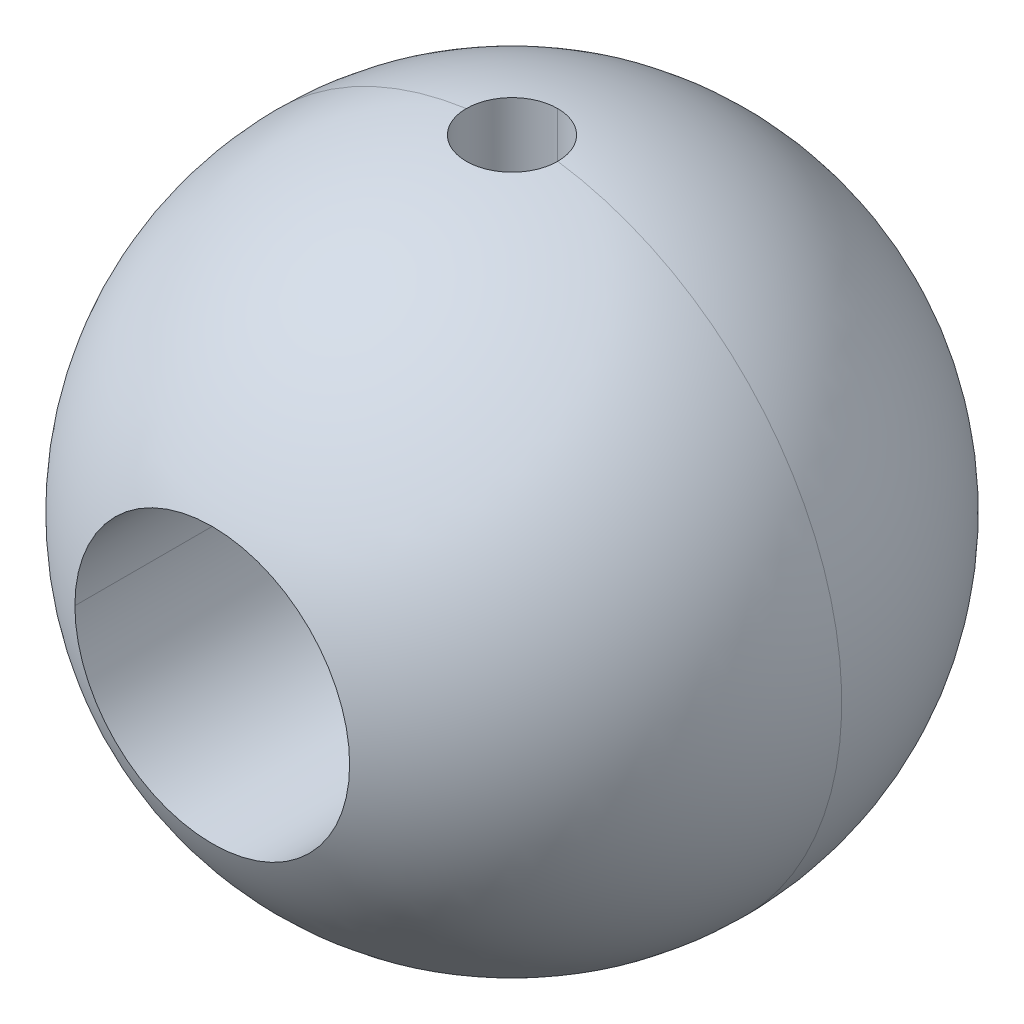
ISO-10303-21;
HEADER;
FILE_DESCRIPTION(('STEP AP214'),'2;1');
FILE_NAME('part.step','',(''),(''),'','','');
FILE_SCHEMA(('AUTOMOTIVE_DESIGN { 1 0 10303 214 1 1 1 1 }'));
ENDSEC;
DATA;
#1=APPLICATION_CONTEXT('core data for automotive mechanical design processes');
#2=APPLICATION_PROTOCOL_DEFINITION('international standard','automotive_design',2000,#1);
#3=PRODUCT_CONTEXT('',#1,'mechanical');
#4=PRODUCT('Part','Part','',(#3));
#5=PRODUCT_RELATED_PRODUCT_CATEGORY('part','',(#4));
#6=PRODUCT_DEFINITION_FORMATION('','',#4);
#7=PRODUCT_DEFINITION_CONTEXT('part definition',#1,'design');
#8=PRODUCT_DEFINITION('design','',#6,#7);
#9=PRODUCT_DEFINITION_SHAPE('','',#8);
#10=(LENGTH_UNIT() NAMED_UNIT(*) SI_UNIT(.MILLI.,.METRE.));
#11=(NAMED_UNIT(*) PLANE_ANGLE_UNIT() SI_UNIT($,.RADIAN.));
#12=(NAMED_UNIT(*) SI_UNIT($,.STERADIAN.) SOLID_ANGLE_UNIT());
#13=UNCERTAINTY_MEASURE_WITH_UNIT(LENGTH_MEASURE(1.E-05),#10,'distance_accuracy_value','');
#14=(GEOMETRIC_REPRESENTATION_CONTEXT(3) GLOBAL_UNCERTAINTY_ASSIGNED_CONTEXT((#13)) GLOBAL_UNIT_ASSIGNED_CONTEXT((#10,
#11,#12)) REPRESENTATION_CONTEXT('',''));
#15=CARTESIAN_POINT('',(0.,0.,0.));
#16=DIRECTION('',(0.,0.,1.));
#17=DIRECTION('',(1.,0.,0.));
#18=AXIS2_PLACEMENT_3D('',#15,#16,#17);
#19=CARTESIAN_POINT('',(0.,0.,-8.6587902516));
#20=DIRECTION('',(0.,0.,1.));
#21=DIRECTION('',(1.,0.,0.));
#22=AXIS2_PLACEMENT_3D('',#19,#20,#21);
#23=CYLINDRICAL_SURFACE('',#22,3.96875);
#24=DIRECTION('',(0.,0.,1.));
#25=VECTOR('',#24,1.);
#26=CARTESIAN_POINT('',(3.96875,-7.12736925620965E-10,0.));
#27=LINE('',#26,#25);
#28=CARTESIAN_POINT('',(3.96875,-3.56368462810483E-10,8.6587902516));
#29=VERTEX_POINT('',#28);
#30=CARTESIAN_POINT('',(3.96875,-7.12736925620965E-10,-8.6587902516));
#31=VERTEX_POINT('',#30);
#32=EDGE_CURVE('E165',#29,#31,#27,.F.);
#33=ORIENTED_EDGE('',*,*,#32,.F.);
#34=CARTESIAN_POINT('',(0.,0.,8.6587902516));
#35=DIRECTION('',(0.,0.,1.));
#36=DIRECTION('',(1.,0.,0.));
#37=AXIS2_PLACEMENT_3D('',#34,#35,#36);
#38=CIRCLE('',#37,3.96875);
#39=CARTESIAN_POINT('',(-3.96875,-1.62800758261697E-09,8.6587902516));
#40=VERTEX_POINT('',#39);
#41=EDGE_CURVE('E157',#29,#40,#38,.T.);
#42=ORIENTED_EDGE('',*,*,#41,.T.);
#43=DIRECTION('',(0.,0.,-1.));
#44=VECTOR('',#43,1.);
#45=CARTESIAN_POINT('',(-3.96875,-1.62800846385649E-09,0.));
#46=LINE('',#45,#44);
#47=CARTESIAN_POINT('',(-3.96875,-1.62800797784085E-09,-8.6587902516));
#48=VERTEX_POINT('',#47);
#49=EDGE_CURVE('E161',#48,#40,#46,.F.);
#50=ORIENTED_EDGE('',*,*,#49,.F.);
#51=CARTESIAN_POINT('',(0.,0.,-8.6587902516));
#52=DIRECTION('',(0.,0.,1.));
#53=DIRECTION('',(1.,0.,0.));
#54=AXIS2_PLACEMENT_3D('',#51,#52,#53);
#55=CIRCLE('',#54,3.96875);
#56=EDGE_CURVE('E99',#31,#48,#55,.T.);
#57=ORIENTED_EDGE('',*,*,#56,.F.);
#58=EDGE_LOOP('',(#33,#42,#50,#57));
#59=FACE_BOUND('',#58,.T.);
#60=CARTESIAN_POINT('',(-5.41800906794258E-10,3.96875,-1.3208));
#61=CARTESIAN_POINT('',(0.0361049955437085,3.9687526643952,-1.32080083444211));
#62=CARTESIAN_POINT('',(0.0721917891521218,3.96825672626489,-1.31931860426641));
#63=CARTESIAN_POINT('',(0.144089183652949,3.9662961150903,-1.31341250629876));
#64=CARTESIAN_POINT('',(0.179899845887164,3.96483166386044,-1.30898931206203));
#65=CARTESIAN_POINT('',(0.286327873673207,3.9590417541917,-1.29138617214641));
#66=CARTESIAN_POINT('',(0.356203534754286,3.95331932807667,-1.273872253859));
#67=CARTESIAN_POINT('',(0.491825460845371,3.93874966947145,-1.22790658851783));
#68=CARTESIAN_POINT('',(0.557573256463703,3.92990360338031,-1.19945892388634));
#69=CARTESIAN_POINT('',(0.683394658019107,3.90998829049197,-1.13250359659386));
#70=CARTESIAN_POINT('',(0.743465411632875,3.89891793478214,-1.09399091315782));
#71=CARTESIAN_POINT('',(0.858255942415323,3.8752957505329,-1.0066147546163));
#72=CARTESIAN_POINT('',(0.9127525544827,3.86270867381294,-0.957467804720228));
#73=CARTESIAN_POINT('',(1.01290456078959,3.83766475411566,-0.850817359497009));
#74=CARTESIAN_POINT('',(1.05855763148802,3.82520794617606,-0.793311674934132));
#75=CARTESIAN_POINT('',(1.14100147428762,3.80144582595455,-0.669560357406593));
#76=CARTESIAN_POINT('',(1.17750092851826,3.79018371909285,-0.603111555368704));
#77=CARTESIAN_POINT('',(1.23870932586888,3.7706253819643,-0.464586234135364));
#78=CARTESIAN_POINT('',(1.26342235626772,3.76232812380222,-0.392511675935477));
#79=CARTESIAN_POINT('',(1.29951792632043,3.75001129400339,-0.247327558575374));
#80=CARTESIAN_POINT('',(1.31132052424531,3.74585734222001,-0.174334171845499));
#81=CARTESIAN_POINT('',(1.3225734074132,3.74189993248002,-0.0272925099211243));
#82=CARTESIAN_POINT('',(1.32202723881552,3.7420952255632,0.0467554563287352));
#83=CARTESIAN_POINT('',(1.30892382100784,3.74669662556392,0.190221360812612));
#84=CARTESIAN_POINT('',(1.29691465265693,3.75091057978112,0.25969658945565));
#85=CARTESIAN_POINT('',(1.26212029121342,3.76276005557281,0.39558252390266));
#86=CARTESIAN_POINT('',(1.23933394416889,3.77039594354167,0.461992900705779));
#87=CARTESIAN_POINT('',(1.18327240802845,3.78836617560315,0.59111219013784));
#88=CARTESIAN_POINT('',(1.1498344923937,3.79874192586162,0.653744437012854));
#89=CARTESIAN_POINT('',(1.07353195079766,3.82100530805837,0.772681944155876));
#90=CARTESIAN_POINT('',(1.03066466688722,3.8328933658865,0.828985413693723));
#91=CARTESIAN_POINT('',(0.934091600400959,3.85759718692826,0.936742958828293));
#92=CARTESIAN_POINT('',(0.879938475544119,3.87042906223534,0.987793202366165));
#93=CARTESIAN_POINT('',(0.763669715073524,3.89503669098322,1.08020164176311));
#94=CARTESIAN_POINT('',(0.701552003794313,3.90681216774951,1.12155730312484));
#95=CARTESIAN_POINT('',(0.570251564786745,3.92813661098901,1.19373249822408));
#96=CARTESIAN_POINT('',(0.501002370205903,3.9376612724586,1.22443855659172));
#97=CARTESIAN_POINT('',(0.357963008287334,3.95322491444282,1.27360649690788));
#98=CARTESIAN_POINT('',(0.284179709594416,3.95926903022271,1.29208642355952));
#99=CARTESIAN_POINT('',(0.174736508423645,3.96505428470127,1.30966175505219));
#100=CARTESIAN_POINT('',(0.139910865651016,3.96643704738505,1.3138372665085));
#101=CARTESIAN_POINT('',(0.0700629359604369,3.96828520690803,1.31940438013534));
#102=CARTESIAN_POINT('',(0.0350409936419948,3.96875188857581,1.32079988138678));
#103=CARTESIAN_POINT('',(-4.74184375992347E-11,3.96875000000004,1.32080000000012));
#104=B_SPLINE_CURVE_WITH_KNOTS('',3,(#60,#61,#62,#63,#64,#65,#66,#67,#68,#69,#70,#71,#72,#73,
#74,#75,#76,#77,#78,#79,#80,#81,#82,#83,#84,#85,#86,#87,#88,#89,#90,#91,#92,#93,#94,#95,#96,#97,
#98,#99,#100,#101,#102,#103),.UNSPECIFIED.,.F.,.F.,(4,2,2,2,2,2,2,2,2,2,2,2,2,2,2,2,2,2,2,2,2,
4),(0.,0.108245527077356,0.216466271724348,0.432131417011641,0.647716115744497,
0.863408561437439,1.08577693697553,1.30820365829599,1.53700174146325,1.76572042457114,
1.98675310538404,2.20772231369235,2.41862925199836,2.62955877799553,2.84387913715239,
3.05825998649885,3.28377700124151,3.50935290830235,3.73726345327458,3.96483686728227,
4.07003915812244,4.1750937941623),.UNSPECIFIED.);
#105=CARTESIAN_POINT('',(-5.41801061782849E-10,3.96875,-1.3208));
#106=VERTEX_POINT('',#105);
#107=CARTESIAN_POINT('',(-4.74397424558337E-11,3.96875,1.3208));
#108=VERTEX_POINT('',#107);
#109=EDGE_CURVE('E82',#106,#108,#104,.T.);
#110=ORIENTED_EDGE('',*,*,#109,.F.);
#111=CARTESIAN_POINT('',(-4.74397424558337E-11,3.96875,1.3208));
#112=CARTESIAN_POINT('',(-0.0361049961347912,3.96875266438983,1.320800834426));
#113=CARTESIAN_POINT('',(-0.0721917897443044,3.96825672625412,1.31931860423405));
#114=CARTESIAN_POINT('',(-0.144089184245831,3.96629611506877,1.31341250623377));
#115=CARTESIAN_POINT('',(-0.179899846479646,3.96483166383355,1.30898931198065));
#116=CARTESIAN_POINT('',(-0.286327874262235,3.95904175414907,1.29138617201598));
#117=CARTESIAN_POINT('',(-0.356203535338046,3.95331932802395,1.27387225369592));
#118=CARTESIAN_POINT('',(-0.49182546141298,3.93874966940045,1.22790658829063));
#119=CARTESIAN_POINT('',(-0.557573257020437,3.92990360330112,1.1994589236277));
#120=CARTESIAN_POINT('',(-0.683394658549221,3.90998829039912,1.13250359627414));
#121=CARTESIAN_POINT('',(-0.743465412147237,3.89891793468381,1.09399091280846));
#122=CARTESIAN_POINT('',(-0.858255942894383,3.87529575042655,1.00661475420817));
#123=CARTESIAN_POINT('',(-0.912752554941919,3.86270867370414,0.957467804282851));
#124=CARTESIAN_POINT('',(-1.0129045612043,3.83766475400591,0.850817359003736));
#125=CARTESIAN_POINT('',(-1.05855763187805,3.82520794606783,0.79331167441422));
#126=CARTESIAN_POINT('',(-1.14100147461983,3.80144582585448,0.669560356840539));
#127=CARTESIAN_POINT('',(-1.17750092881792,3.79018371899945,0.603111554783771));
#128=CARTESIAN_POINT('',(-1.23870932610037,3.77062538188795,0.464586233518293));
#129=CARTESIAN_POINT('',(-1.26342235646358,3.76232812373625,0.392511675305149));
#130=CARTESIAN_POINT('',(-1.29951792644271,3.75001129396083,0.247327557931382));
#131=CARTESIAN_POINT('',(-1.31132052433064,3.74585734219008,0.174334171201145));
#132=CARTESIAN_POINT('',(-1.32257340742605,3.74189993247542,0.0272925092829452));
#133=CARTESIAN_POINT('',(-1.32202723879282,3.74209522557129,-0.0467554569603804));
#134=CARTESIAN_POINT('',(-1.30892382091812,3.74669662559533,-0.190221361429086));
#135=CARTESIAN_POINT('',(-1.29691465253502,3.75091057982343,-0.259696590063704));
#136=CARTESIAN_POINT('',(-1.26212029102955,3.76276005563465,-0.395582524488812));
#137=CARTESIAN_POINT('',(-1.23933394395525,3.77039594361212,-0.461992901278447));
#138=CARTESIAN_POINT('',(-1.18327240775509,3.78836617568879,-0.591112190685487));
#139=CARTESIAN_POINT('',(-1.14983449208945,3.79874192595404,-0.653744437548428));
#140=CARTESIAN_POINT('',(-1.07353195043326,3.82100530816107,-0.772681944662522));
#141=CARTESIAN_POINT('',(-1.03066466649358,3.8328933659927,-0.828985414183515));
#142=CARTESIAN_POINT('',(-0.93409159994989,3.85759718703787,-0.936742959278418));
#143=CARTESIAN_POINT('',(-0.879938475065047,3.87042906234464,-0.987793202793303));
#144=CARTESIAN_POINT('',(-0.763669714541515,3.89503669108791,-1.08020164213956));
#145=CARTESIAN_POINT('',(-0.701552003237361,3.90681216784989,-1.12155730347358));
#146=CARTESIAN_POINT('',(-0.570251564190088,3.9281366110759,-1.19373249850902));
#147=CARTESIAN_POINT('',(-0.501002369595132,3.9376612725365,-1.22443855684157));
#148=CARTESIAN_POINT('',(-0.357963007655084,3.95322491450023,-1.27360649708546));
#149=CARTESIAN_POINT('',(-0.28417970895483,3.95926903026865,-1.29208642370002));
#150=CARTESIAN_POINT('',(-0.174736507981818,3.96505428471897,-1.30966175510561));
#151=CARTESIAN_POINT('',(-0.139910865413777,3.96643704739162,-1.31383726652826));
#152=CARTESIAN_POINT('',(-0.070062936135266,3.96828520690311,-1.31940438012055));
#153=CARTESIAN_POINT('',(-0.0350409940243019,3.96875188857053,-1.32079988137108));
#154=CARTESIAN_POINT('',(-5.41822186167864E-10,3.96875000000004,-1.32080000000012));
#155=B_SPLINE_CURVE_WITH_KNOTS('',3,(#111,#112,#113,#114,#115,#116,#117,#118,#119,#120,#121,
#122,#123,#124,#125,#126,#127,#128,#129,#130,#131,#132,#133,#134,#135,#136,#137,#138,#139,#140,
#141,#142,#143,#144,#145,#146,#147,#148,#149,#150,#151,#152,#153,#154),.UNSPECIFIED.,.F.,.F.,(4,
2,2,2,2,2,2,2,2,2,2,2,2,2,2,2,2,2,2,2,2,4),(0.,0.108245527082865,0.216466271735328,
0.432131417033438,0.64771611577678,0.863408561480334,1.08577693703387,1.30820365836962,
1.53700174153639,1.76572042464362,1.98675310543796,2.20772231372787,2.4186292520276,
2.6295587780186,2.84387913718993,3.05825998655075,3.28377700130669,3.50935290838113,
3.73726345334614,3.96483686734484,4.07003915756482,4.1750937929847),.UNSPECIFIED.);
#156=EDGE_CURVE('E21',#108,#106,#155,.T.);
#157=ORIENTED_EDGE('',*,*,#156,.F.);
#158=EDGE_LOOP('',(#110,#157));
#159=FACE_BOUND('',#158,.T.);
#160=ADVANCED_FACE('F17',(#59,#159),#23,.F.);
#161=CARTESIAN_POINT('',(0.,3.70837329330399,0.));
#162=DIRECTION('',(0.,1.,0.));
#163=DIRECTION('',(0.,0.,1.));
#164=AXIS2_PLACEMENT_3D('',#161,#162,#163);
#165=CYLINDRICAL_SURFACE('',#164,1.3208);
#166=CARTESIAN_POINT('',(0.,9.4329800223016,0.));
#167=DIRECTION('',(0.,1.,0.));
#168=DIRECTION('',(1.,0.,0.));
#169=AXIS2_PLACEMENT_3D('',#166,#167,#168);
#170=CIRCLE('',#169,1.32080009799326);
#171=CARTESIAN_POINT('',(-1.32080009799326,9.4329800223016,5.41801256968949E-10));
#172=VERTEX_POINT('',#171);
#173=CARTESIAN_POINT('',(-3.38732225139508E-10,9.4329800223016,1.32080006532884));
#174=VERTEX_POINT('',#173);
#175=EDGE_CURVE('E176',#172,#174,#170,.T.);
#176=ORIENTED_EDGE('',*,*,#175,.T.);
#177=DIRECTION('',(0.,-1.,0.));
#178=VECTOR('',#177,1.);
#179=CARTESIAN_POINT('',(0.,6.5692913699,1.3208));
#180=LINE('',#179,#178);
#181=EDGE_CURVE('E93',#108,#174,#180,.F.);
#182=ORIENTED_EDGE('',*,*,#181,.F.);
#183=ORIENTED_EDGE('',*,*,#156,.T.);
#184=DIRECTION('',(0.,1.,0.));
#185=VECTOR('',#184,1.);
#186=CARTESIAN_POINT('',(-5.41801216771441E-10,6.5692913699,-1.3208));
#187=LINE('',#186,#185);
#188=CARTESIAN_POINT('',(-3.6120073195095E-10,9.4329800223016,-1.32080006532884));
#189=VERTEX_POINT('',#188);
#190=EDGE_CURVE('E91',#189,#106,#187,.F.);
#191=ORIENTED_EDGE('',*,*,#190,.F.);
#192=CARTESIAN_POINT('',(0.,9.4329800223016,0.));
#193=DIRECTION('',(0.,1.,0.));
#194=DIRECTION('',(1.,0.,0.));
#195=AXIS2_PLACEMENT_3D('',#192,#193,#194);
#196=CIRCLE('',#195,1.32080009799326);
#197=EDGE_CURVE('E167',#172,#189,#196,.F.);
#198=ORIENTED_EDGE('',*,*,#197,.F.);
#199=EDGE_LOOP('',(#176,#182,#183,#191,#198));
#200=FACE_BOUND('',#199,.T.);
#201=ADVANCED_FACE('F89',(#200),#165,.F.);
#202=CARTESIAN_POINT('',(0.,3.70835683231559,0.));
#203=DIRECTION('',(0.,1.,0.));
#204=DIRECTION('',(-1.,0.,0.));
#205=AXIS2_PLACEMENT_3D('',#202,#203,#204);
#206=CYLINDRICAL_SURFACE('',#205,1.3208);
#207=CARTESIAN_POINT('',(0.,9.4329800223016,0.));
#208=DIRECTION('',(0.,1.,0.));
#209=DIRECTION('',(1.,0.,0.));
#210=AXIS2_PLACEMENT_3D('',#207,#208,#209);
#211=CIRCLE('',#210,1.32080009799326);
#212=CARTESIAN_POINT('',(1.32080004899663,9.4329800320508,-7.61505281591025E-11));
#213=VERTEX_POINT('',#212);
#214=EDGE_CURVE('E178',#174,#213,#211,.T.);
#215=ORIENTED_EDGE('',*,*,#214,.T.);
#216=CARTESIAN_POINT('',(0.,9.4329800223016,0.));
#217=DIRECTION('',(0.,1.,0.));
#218=DIRECTION('',(1.,0.,0.));
#219=AXIS2_PLACEMENT_3D('',#216,#217,#218);
#220=CIRCLE('',#219,1.32080009799326);
#221=EDGE_CURVE('E97',#189,#213,#220,.F.);
#222=ORIENTED_EDGE('',*,*,#221,.F.);
#223=ORIENTED_EDGE('',*,*,#190,.T.);
#224=ORIENTED_EDGE('',*,*,#109,.T.);
#225=ORIENTED_EDGE('',*,*,#181,.T.);
#226=EDGE_LOOP('',(#215,#222,#223,#224,#225));
#227=FACE_BOUND('',#226,.T.);
#228=ADVANCED_FACE('F96',(#227),#206,.F.);
#229=CARTESIAN_POINT('',(0.,0.,0.));
#230=DIRECTION('',(0.,1.,0.));
#231=DIRECTION('',(-1.,0.,0.));
#232=AXIS2_PLACEMENT_3D('',#229,#230,#231);
#233=SPHERICAL_SURFACE('',#232,9.525);
#234=ORIENTED_EDGE('',*,*,#221,.T.);
#235=CARTESIAN_POINT('',(0.,0.,0.));
#236=DIRECTION('',(-1.79587256849377E-10,0.,1.));
#237=DIRECTION('',(0.,-1.,0.));
#238=AXIS2_PLACEMENT_3D('',#235,#236,#237);
#239=CIRCLE('',#238,9.525);
#240=CARTESIAN_POINT('',(1.3208,-9.43298004180001,-2.70900489540704E-10));
#241=VERTEX_POINT('',#240);
#242=EDGE_CURVE('E179',#213,#241,#239,.F.);
#243=ORIENTED_EDGE('',*,*,#242,.T.);
#244=CARTESIAN_POINT('',(0.,-9.43298004180001,0.));
#245=DIRECTION('',(0.,1.,0.));
#246=DIRECTION('',(0.,0.,1.));
#247=AXIS2_PLACEMENT_3D('',#244,#245,#246);
#248=CIRCLE('',#247,1.3208);
#249=CARTESIAN_POINT('',(-5.41801216771441E-10,-9.43298004180001,-1.3208));
#250=VERTEX_POINT('',#249);
#251=EDGE_CURVE('E158',#250,#241,#248,.F.);
#252=ORIENTED_EDGE('',*,*,#251,.F.);
#253=CARTESIAN_POINT('',(0.,-9.43298004180001,0.));
#254=DIRECTION('',(0.,1.,0.));
#255=DIRECTION('',(0.,0.,1.));
#256=AXIS2_PLACEMENT_3D('',#253,#254,#255);
#257=CIRCLE('',#256,1.3208);
#258=CARTESIAN_POINT('',(-1.32079999973553,-9.43298003991122,1.91834685753922E-10));
#259=VERTEX_POINT('',#258);
#260=EDGE_CURVE('E198',#259,#250,#257,.F.);
#261=ORIENTED_EDGE('',*,*,#260,.F.);
#262=CARTESIAN_POINT('',(0.,0.,0.));
#263=DIRECTION('',(-4.10206857034707E-10,0.,-1.));
#264=DIRECTION('',(0.,-1.,0.));
#265=AXIS2_PLACEMENT_3D('',#262,#263,#264);
#266=CIRCLE('',#265,9.525);
#267=EDGE_CURVE('E175',#259,#172,#266,.T.);
#268=ORIENTED_EDGE('',*,*,#267,.T.);
#269=ORIENTED_EDGE('',*,*,#197,.T.);
#270=EDGE_LOOP('',(#234,#243,#252,#261,#268,#269));
#271=FACE_BOUND('',#270,.T.);
#272=ORIENTED_EDGE('',*,*,#56,.T.);
#273=CARTESIAN_POINT('',(0.,0.,-8.6587902516));
#274=DIRECTION('',(0.,0.,1.));
#275=DIRECTION('',(1.,0.,0.));
#276=AXIS2_PLACEMENT_3D('',#273,#274,#275);
#277=CIRCLE('',#276,3.96875);
#278=EDGE_CURVE('E159',#31,#48,#277,.F.);
#279=ORIENTED_EDGE('',*,*,#278,.F.);
#280=EDGE_LOOP('',(#272,#279));
#281=FACE_BOUND('',#280,.T.);
#282=ADVANCED_FACE('F111',(#271,#281),#233,.T.);
#283=CARTESIAN_POINT('',(0.,0.,-8.6587902516));
#284=DIRECTION('',(0.,0.,1.));
#285=DIRECTION('',(1.,0.,0.));
#286=AXIS2_PLACEMENT_3D('',#283,#284,#285);
#287=CYLINDRICAL_SURFACE('',#286,3.96875);
#288=CARTESIAN_POINT('',(0.,0.,8.6587902516));
#289=DIRECTION('',(0.,0.,1.));
#290=DIRECTION('',(1.,0.,0.));
#291=AXIS2_PLACEMENT_3D('',#288,#289,#290);
#292=CIRCLE('',#291,3.96875);
#293=EDGE_CURVE('E143',#40,#29,#292,.T.);
#294=ORIENTED_EDGE('',*,*,#293,.T.);
#295=ORIENTED_EDGE('',*,*,#32,.T.);
#296=ORIENTED_EDGE('',*,*,#278,.T.);
#297=ORIENTED_EDGE('',*,*,#49,.T.);
#298=EDGE_LOOP('',(#294,#295,#296,#297));
#299=FACE_BOUND('',#298,.T.);
#300=CARTESIAN_POINT('',(-5.41800850676633E-10,-3.96875,-1.3208));
#301=CARTESIAN_POINT('',(-0.0361049966306977,-3.96875266438534,-1.32080083441249));
#302=CARTESIAN_POINT('',(-0.0721917902411336,-3.96825672624509,-1.3193186042069));
#303=CARTESIAN_POINT('',(-0.144089184743247,-3.9662961150507,-1.31341250617923));
#304=CARTESIAN_POINT('',(-0.179899846976727,-3.96483166381099,-1.30898931191237));
#305=CARTESIAN_POINT('',(-0.286327874756417,-3.9590417541133,-1.29138617190655));
#306=CARTESIAN_POINT('',(-0.356203535827809,-3.95331932797972,-1.2738722535591));
#307=CARTESIAN_POINT('',(-0.491825461889193,-3.93874966934088,-1.22790658810002));
#308=CARTESIAN_POINT('',(-0.557573257487526,-3.92990360323469,-1.1994589234107));
#309=CARTESIAN_POINT('',(-0.683394658993975,-3.90998829032122,-1.13250359600589));
#310=CARTESIAN_POINT('',(-0.743465412578777,-3.89891793460132,-1.09399091251535));
#311=CARTESIAN_POINT('',(-0.858255943296306,-3.87529575033733,-1.00661475386576));
#312=CARTESIAN_POINT('',(-0.912752555327195,-3.86270867361286,-0.957467803915902));
#313=CARTESIAN_POINT('',(-1.01290456155223,-3.83766475391384,-0.850817358589891));
#314=CARTESIAN_POINT('',(-1.05855763220529,-3.82520794597702,-0.793311673978024));
#315=CARTESIAN_POINT('',(-1.14100147489855,-3.80144582577053,-0.669560356365631));
#316=CARTESIAN_POINT('',(-1.17750092906933,-3.7901837189211,-0.603111554293025));
#317=CARTESIAN_POINT('',(-1.23870932629458,-3.7706253818239,-0.464586233000584));
#318=CARTESIAN_POINT('',(-1.26342235662791,-3.7623281236809,-0.392511674776316));
#319=CARTESIAN_POINT('',(-1.29951792654529,-3.75001129392511,-0.247327557391087));
#320=CARTESIAN_POINT('',(-1.31132052440223,-3.74585734216496,-0.174334170660547));
#321=CARTESIAN_POINT('',(-1.32257340743682,-3.74189993247155,-0.0272925087475276));
#322=CARTESIAN_POINT('',(-1.32202723877377,-3.74209522557808,0.0467554574903168));
#323=CARTESIAN_POINT('',(-1.30892382084284,-3.74669662562168,0.190221361946298));
#324=CARTESIAN_POINT('',(-1.29691465243273,-3.75091057985893,0.259696590573856));
#325=CARTESIAN_POINT('',(-1.26212029087528,-3.76276005568652,0.395582524980588));
#326=CARTESIAN_POINT('',(-1.239333943776,-3.77039594367123,0.461992901758906));
#327=CARTESIAN_POINT('',(-1.18327240752576,-3.78836617576063,0.591112191144938));
#328=CARTESIAN_POINT('',(-1.1498344918342,-3.79874192603156,0.653744437997735));
#329=CARTESIAN_POINT('',(-1.07353195012756,-3.82100530824722,0.772681945087562));
#330=CARTESIAN_POINT('',(-1.03066466616334,-3.8328933660818,0.828985414594429));
#331=CARTESIAN_POINT('',(-0.934091599571407,-3.85759718712983,0.936742959656113));
#332=CARTESIAN_POINT('',(-0.879938474663014,-3.87042906243637,0.987793203151755));
#333=CARTESIAN_POINT('',(-0.763669714095063,-3.89503669117577,1.08020164245547));
#334=CARTESIAN_POINT('',(-0.701552002770045,-3.90681216793411,1.12155730376619));
#335=CARTESIAN_POINT('',(-0.570251563689697,-3.92813661114876,1.19373249874797));
#336=CARTESIAN_POINT('',(-0.501002369083086,-3.93766127260179,1.224438557051));
#337=CARTESIAN_POINT('',(-0.357963007125158,-3.95322491454835,1.27360649723432));
#338=CARTESIAN_POINT('',(-0.284179708418671,-3.95926903030718,1.29208642381784));
#339=CARTESIAN_POINT('',(-0.174736507456354,-3.96505428474201,1.30966175517528));
#340=CARTESIAN_POINT('',(-0.139910864903073,-3.9664370474095,1.31383726658221));
#341=CARTESIAN_POINT('',(-0.0700629356554848,-3.96828520691145,1.31940438014559));
#342=CARTESIAN_POINT('',(-0.0350409935606809,-3.96875188857447,1.32079988138293));
#343=CARTESIAN_POINT('',(-9.49010812161098E-11,-3.96875000000004,1.32080000000012));
#344=B_SPLINE_CURVE_WITH_KNOTS('',3,(#300,#301,#302,#303,#304,#305,#306,#307,#308,#309,#310,
#311,#312,#313,#314,#315,#316,#317,#318,#319,#320,#321,#322,#323,#324,#325,#326,#327,#328,#329,
#330,#331,#332,#333,#334,#335,#336,#337,#338,#339,#340,#341,#342,#343),.UNSPECIFIED.,.F.,.F.,(4,
2,2,2,2,2,2,2,2,2,2,2,2,2,2,2,2,2,2,2,2,4),(0.,0.108245527087487,0.216466271744539,
0.432131417051725,0.647716115803863,0.863408561516322,1.0857769370828,1.30820365843139,
1.53700174159774,1.76572042470442,1.9867531054832,2.20772231375768,2.41862925205215,
2.62955877803796,2.84387913722137,3.0582599865943,3.28377700136157,3.50935290844723,
3.73726345340546,3.96483686739734,4.07003915756733,4.17509379293718),.UNSPECIFIED.);
#345=CARTESIAN_POINT('',(-5.41801033724037E-10,-3.96875,-1.3208));
#346=VERTEX_POINT('',#345);
#347=CARTESIAN_POINT('',(-9.48797171471016E-11,-3.96875,1.3208));
#348=VERTEX_POINT('',#347);
#349=EDGE_CURVE('E135',#346,#348,#344,.T.);
#350=ORIENTED_EDGE('',*,*,#349,.F.);
#351=CARTESIAN_POINT('',(-9.48797171471016E-11,-3.96875,1.3208));
#352=CARTESIAN_POINT('',(0.0361049959920269,-3.96875266439113,1.32080083442989));
#353=CARTESIAN_POINT('',(0.0721917896012744,-3.96825672625672,1.31931860424186));
#354=CARTESIAN_POINT('',(0.144089184102632,-3.96629611507397,1.31341250624946));
#355=CARTESIAN_POINT('',(0.179899846336544,-3.96483166384004,1.3089893120003));
#356=CARTESIAN_POINT('',(0.286327874119967,-3.95904175415936,1.29138617204748));
#357=CARTESIAN_POINT('',(0.356203535197051,-3.95331932803669,1.27387225373531));
#358=CARTESIAN_POINT('',(0.491825461275885,-3.9387496694176,1.22790658834551));
#359=CARTESIAN_POINT('',(0.557573256885969,-3.92990360332025,1.19945892369017));
#360=CARTESIAN_POINT('',(0.683394658421182,-3.90998829042155,1.13250359635136));
#361=CARTESIAN_POINT('',(0.743465412023003,-3.89891793470756,1.09399091289284));
#362=CARTESIAN_POINT('',(0.858255942778676,-3.87529575045224,1.00661475430674));
#363=CARTESIAN_POINT('',(0.912752554831004,-3.86270867373042,0.957467804388491));
#364=CARTESIAN_POINT('',(1.01290456110413,-3.83766475403242,0.850817359122876));
#365=CARTESIAN_POINT('',(1.05855763178385,-3.82520794609397,0.793311674539794));
#366=CARTESIAN_POINT('',(1.14100147453959,-3.80144582587865,0.669560356977258));
#367=CARTESIAN_POINT('',(1.17750092874554,-3.79018371902201,0.60311155492505));
#368=CARTESIAN_POINT('',(1.23870932604446,-3.77062538190639,0.464586233667334));
#369=CARTESIAN_POINT('',(1.26342235641628,-3.76232812375218,0.392511675457392));
#370=CARTESIAN_POINT('',(1.29951792641317,-3.75001129397111,0.247327558086926));
#371=CARTESIAN_POINT('',(1.31132052431003,-3.7458573421973,0.174334171356777));
#372=CARTESIAN_POINT('',(1.32257340742294,-3.74189993247653,0.0272925094370859));
#373=CARTESIAN_POINT('',(1.3220272387983,-3.74209522556934,-0.0467554568078185));
#374=CARTESIAN_POINT('',(1.30892382093979,-3.74669662558775,-0.190221361280193));
#375=CARTESIAN_POINT('',(1.29691465256446,-3.75091057981321,-0.259696589916848));
#376=CARTESIAN_POINT('',(1.26212029107396,-3.76276005561971,-0.395582524347245));
#377=CARTESIAN_POINT('',(1.23933394400685,-3.77039594359511,-0.461992901140134));
#378=CARTESIAN_POINT('',(1.18327240782112,-3.7883661756681,-0.591112190553199));
#379=CARTESIAN_POINT('',(1.14983449216295,-3.79874192593171,-0.653744437419042));
#380=CARTESIAN_POINT('',(1.07353195052129,-3.82100530813626,-0.772681944540126));
#381=CARTESIAN_POINT('',(1.03066466658867,-3.83289336596705,-0.828985414065204));
#382=CARTESIAN_POINT('',(0.934091600058791,-3.8575971870114,-0.936742959169749));
#383=CARTESIAN_POINT('',(0.879938475180655,-3.87042906231827,-0.987793202690229));
#384=CARTESIAN_POINT('',(0.763669714669903,-3.89503669106265,-1.08020164204871));
#385=CARTESIAN_POINT('',(0.701552003371837,-3.90681216782565,-1.12155730338938));
#386=CARTESIAN_POINT('',(0.57025156433439,-3.92813661105488,-1.19373249844009));
#387=CARTESIAN_POINT('',(0.501002369743031,-3.93766127251762,-1.22443855678104));
#388=CARTESIAN_POINT('',(0.357963007808309,-3.95322491448632,-1.27360649704244));
#389=CARTESIAN_POINT('',(0.284179709109749,-3.95926903025754,-1.29208642366603));
#390=CARTESIAN_POINT('',(0.174736507933752,-3.96505428472287,-1.30966175511756));
#391=CARTESIAN_POINT('',(0.139910865159412,-3.9664370474024,-1.31383726656085));
#392=CARTESIAN_POINT('',(0.0700629354665797,-3.96828520691676,-1.31940438016156));
#393=CARTESIAN_POINT('',(0.0350409931475938,-3.96875188858018,-1.32079988139989));
#394=CARTESIAN_POINT('',(-5.41779494130716E-10,-3.96875000000004,-1.32080000000012));
#395=B_SPLINE_CURVE_WITH_KNOTS('',3,(#351,#352,#353,#354,#355,#356,#357,#358,#359,#360,#361,
#362,#363,#364,#365,#366,#367,#368,#369,#370,#371,#372,#373,#374,#375,#376,#377,#378,#379,#380,
#381,#382,#383,#384,#385,#386,#387,#388,#389,#390,#391,#392,#393,#394),.UNSPECIFIED.,.F.,.F.,(4,
2,2,2,2,2,2,2,2,2,2,2,2,2,2,2,2,2,2,2,2,4),(0.,0.108245527081534,0.216466271732676,
0.432131417028173,0.647716115768982,0.863408561469974,1.08577693701978,1.30820365835184,
1.53700174151872,1.76572042462611,1.98675310542494,2.20772231371929,2.41862925202055,
2.62955877801303,2.84387913718081,3.05825998653822,3.28377700129115,3.5093529083621,
3.73726345332814,3.96483686732973,4.07003915816985,4.17509379420958),.UNSPECIFIED.);
#396=EDGE_CURVE('E152',#348,#346,#395,.T.);
#397=ORIENTED_EDGE('',*,*,#396,.F.);
#398=EDGE_LOOP('',(#350,#397));
#399=FACE_BOUND('',#398,.T.);
#400=ADVANCED_FACE('F145',(#299,#399),#287,.F.);
#401=CARTESIAN_POINT('',(0.,-9.4329800418,0.));
#402=DIRECTION('',(0.,1.,0.));
#403=DIRECTION('',(0.,0.,1.));
#404=AXIS2_PLACEMENT_3D('',#401,#402,#403);
#405=CYLINDRICAL_SURFACE('',#404,1.3208);
#406=DIRECTION('',(0.,1.,0.));
#407=VECTOR('',#406,1.);
#408=CARTESIAN_POINT('',(-2.37198848846657E-10,-6.5692913699,1.3208));
#409=LINE('',#408,#407);
#410=CARTESIAN_POINT('',(-1.8632429663898E-10,-9.43298004372415,1.32079997594254));
#411=VERTEX_POINT('',#410);
#412=EDGE_CURVE('E31',#348,#411,#409,.F.);
#413=ORIENTED_EDGE('',*,*,#412,.F.);
#414=ORIENTED_EDGE('',*,*,#396,.T.);
#415=DIRECTION('',(0.,-1.,0.));
#416=VECTOR('',#415,1.);
#417=CARTESIAN_POINT('',(-5.41801216771441E-10,-6.5692913699,-1.3208));
#418=LINE('',#417,#416);
#419=EDGE_CURVE('E142',#250,#346,#418,.F.);
#420=ORIENTED_EDGE('',*,*,#419,.F.);
#421=ORIENTED_EDGE('',*,*,#251,.T.);
#422=CARTESIAN_POINT('',(0.,-9.4329800494966,0.));
#423=DIRECTION('',(0.,1.,0.));
#424=DIRECTION('',(1.,0.,0.));
#425=AXIS2_PLACEMENT_3D('',#422,#423,#424);
#426=CIRCLE('',#425,1.32079990377015);
#427=EDGE_CURVE('E182',#241,#411,#426,.F.);
#428=ORIENTED_EDGE('',*,*,#427,.T.);
#429=EDGE_LOOP('',(#413,#414,#420,#421,#428));
#430=FACE_BOUND('',#429,.T.);
#431=ADVANCED_FACE('F128',(#430),#405,.F.);
#432=CARTESIAN_POINT('',(0.,0.,0.));
#433=DIRECTION('',(0.,1.,0.));
#434=DIRECTION('',(-1.,0.,0.));
#435=AXIS2_PLACEMENT_3D('',#432,#433,#434);
#436=SPHERICAL_SURFACE('',#435,9.525);
#437=CARTESIAN_POINT('',(0.,-9.43298004180001,0.));
#438=DIRECTION('',(0.,1.,0.));
#439=DIRECTION('',(0.,0.,1.));
#440=AXIS2_PLACEMENT_3D('',#437,#438,#439);
#441=CIRCLE('',#440,1.3208);
#442=EDGE_CURVE('E11',#411,#259,#441,.F.);
#443=ORIENTED_EDGE('',*,*,#442,.F.);
#444=ORIENTED_EDGE('',*,*,#427,.F.);
#445=ORIENTED_EDGE('',*,*,#242,.F.);
#446=ORIENTED_EDGE('',*,*,#214,.F.);
#447=ORIENTED_EDGE('',*,*,#175,.F.);
#448=ORIENTED_EDGE('',*,*,#267,.F.);
#449=EDGE_LOOP('',(#443,#444,#445,#446,#447,#448));
#450=FACE_BOUND('',#449,.T.);
#451=ORIENTED_EDGE('',*,*,#41,.F.);
#452=ORIENTED_EDGE('',*,*,#293,.F.);
#453=EDGE_LOOP('',(#451,#452));
#454=FACE_BOUND('',#453,.T.);
#455=ADVANCED_FACE('F123',(#450,#454),#436,.T.);
#456=CARTESIAN_POINT('',(0.,-9.4329800418,0.));
#457=DIRECTION('',(0.,1.,0.));
#458=DIRECTION('',(0.,0.,1.));
#459=AXIS2_PLACEMENT_3D('',#456,#457,#458);
#460=CYLINDRICAL_SURFACE('',#459,1.3208);
#461=ORIENTED_EDGE('',*,*,#412,.T.);
#462=ORIENTED_EDGE('',*,*,#442,.T.);
#463=ORIENTED_EDGE('',*,*,#260,.T.);
#464=ORIENTED_EDGE('',*,*,#419,.T.);
#465=ORIENTED_EDGE('',*,*,#349,.T.);
#466=EDGE_LOOP('',(#461,#462,#463,#464,#465));
#467=FACE_BOUND('',#466,.T.);
#468=ADVANCED_FACE('F121',(#467),#460,.F.);
#469=CLOSED_SHELL('',(#160,#201,#228,#282,#400,#431,#455,#468));
#470=MANIFOLD_SOLID_BREP('B1',#469);
#471=ADVANCED_BREP_SHAPE_REPRESENTATION('',(#18,#470),#14);
#472=SHAPE_DEFINITION_REPRESENTATION(#9,#471);
ENDSEC;
END-ISO-10303-21;
